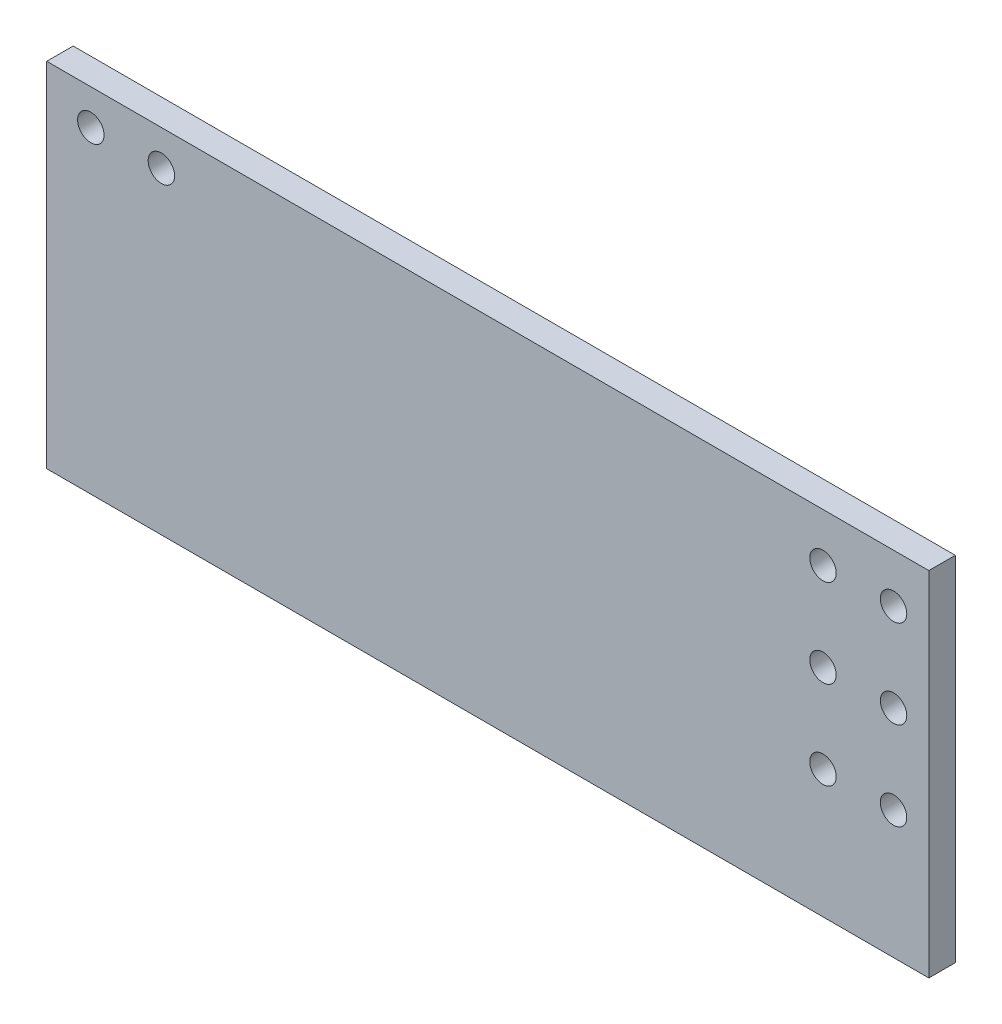
ISO-10303-21;
HEADER;
FILE_DESCRIPTION(('STEP AP214'),'2;1');
FILE_NAME('part.step','',(''),(''),'','','');
FILE_SCHEMA(('AUTOMOTIVE_DESIGN { 1 0 10303 214 1 1 1 1 }'));
ENDSEC;
DATA;
#1=APPLICATION_CONTEXT('core data for automotive mechanical design processes');
#2=APPLICATION_PROTOCOL_DEFINITION('international standard','automotive_design',2000,#1);
#3=PRODUCT_CONTEXT('',#1,'mechanical');
#4=PRODUCT('Part','Part','',(#3));
#5=PRODUCT_RELATED_PRODUCT_CATEGORY('part','',(#4));
#6=PRODUCT_DEFINITION_FORMATION('','',#4);
#7=PRODUCT_DEFINITION_CONTEXT('part definition',#1,'design');
#8=PRODUCT_DEFINITION('design','',#6,#7);
#9=PRODUCT_DEFINITION_SHAPE('','',#8);
#10=(LENGTH_UNIT() NAMED_UNIT(*) SI_UNIT(.MILLI.,.METRE.));
#11=(NAMED_UNIT(*) PLANE_ANGLE_UNIT() SI_UNIT($,.RADIAN.));
#12=(NAMED_UNIT(*) SI_UNIT($,.STERADIAN.) SOLID_ANGLE_UNIT());
#13=UNCERTAINTY_MEASURE_WITH_UNIT(LENGTH_MEASURE(1.E-05),#10,'distance_accuracy_value','');
#14=(GEOMETRIC_REPRESENTATION_CONTEXT(3) GLOBAL_UNCERTAINTY_ASSIGNED_CONTEXT((#13)) GLOBAL_UNIT_ASSIGNED_CONTEXT((#10,
#11,#12)) REPRESENTATION_CONTEXT('',''));
#15=CARTESIAN_POINT('',(0.,0.,0.));
#16=DIRECTION('',(0.,0.,1.));
#17=DIRECTION('',(1.,0.,0.));
#18=AXIS2_PLACEMENT_3D('',#15,#16,#17);
#19=CARTESIAN_POINT('',(0.,0.,3.));
#20=DIRECTION('',(0.,0.,-1.));
#21=DIRECTION('',(-1.,0.,0.));
#22=AXIS2_PLACEMENT_3D('',#19,#20,#21);
#23=PLANE('',#22);
#24=CARTESIAN_POINT('',(-45.,11.5,3.));
#25=DIRECTION('',(0.,0.,1.));
#26=DIRECTION('',(1.,0.,0.));
#27=AXIS2_PLACEMENT_3D('',#24,#25,#26);
#28=CIRCLE('',#27,1.5);
#29=CARTESIAN_POINT('',(-43.5,11.5,3.));
#30=VERTEX_POINT('',#29);
#31=EDGE_CURVE('E147',#30,#30,#28,.T.);
#32=ORIENTED_EDGE('',*,*,#31,.F.);
#33=EDGE_LOOP('',(#32));
#34=FACE_BOUND('',#33,.T.);
#35=CARTESIAN_POINT('',(-37.,11.5,3.));
#36=DIRECTION('',(0.,0.,1.));
#37=DIRECTION('',(1.,0.,0.));
#38=AXIS2_PLACEMENT_3D('',#35,#36,#37);
#39=CIRCLE('',#38,1.5);
#40=CARTESIAN_POINT('',(-35.5,11.5,3.));
#41=VERTEX_POINT('',#40);
#42=EDGE_CURVE('E141',#41,#41,#39,.T.);
#43=ORIENTED_EDGE('',*,*,#42,.F.);
#44=EDGE_LOOP('',(#43));
#45=FACE_BOUND('',#44,.T.);
#46=CARTESIAN_POINT('',(45.9999999999961,0.,3.));
#47=DIRECTION('',(0.,0.,1.));
#48=DIRECTION('',(1.,0.,0.));
#49=AXIS2_PLACEMENT_3D('',#46,#47,#48);
#50=CIRCLE('',#49,1.5);
#51=CARTESIAN_POINT('',(47.4999999999961,0.,3.));
#52=VERTEX_POINT('',#51);
#53=EDGE_CURVE('E116',#52,#52,#50,.T.);
#54=ORIENTED_EDGE('',*,*,#53,.F.);
#55=EDGE_LOOP('',(#54));
#56=FACE_BOUND('',#55,.T.);
#57=CARTESIAN_POINT('',(46.,-10.,3.));
#58=DIRECTION('',(0.,0.,1.));
#59=DIRECTION('',(-1.,0.,0.));
#60=AXIS2_PLACEMENT_3D('',#57,#58,#59);
#61=CIRCLE('',#60,1.5);
#62=CARTESIAN_POINT('',(44.5,-10.,3.));
#63=VERTEX_POINT('',#62);
#64=EDGE_CURVE('E104',#63,#63,#61,.T.);
#65=ORIENTED_EDGE('',*,*,#64,.F.);
#66=EDGE_LOOP('',(#65));
#67=FACE_BOUND('',#66,.T.);
#68=CARTESIAN_POINT('',(38.,10.,3.));
#69=DIRECTION('',(0.,0.,1.));
#70=DIRECTION('',(1.,0.,0.));
#71=AXIS2_PLACEMENT_3D('',#68,#69,#70);
#72=CIRCLE('',#71,1.5);
#73=CARTESIAN_POINT('',(39.5,10.,3.));
#74=VERTEX_POINT('',#73);
#75=EDGE_CURVE('E92',#74,#74,#72,.T.);
#76=ORIENTED_EDGE('',*,*,#75,.F.);
#77=EDGE_LOOP('',(#76));
#78=FACE_BOUND('',#77,.T.);
#79=DIRECTION('',(0.,-1.,0.));
#80=VECTOR('',#79,1.);
#81=CARTESIAN_POINT('',(-50.,-27.5,3.));
#82=LINE('',#81,#80);
#83=CARTESIAN_POINT('',(-50.,15.5,3.));
#84=VERTEX_POINT('',#83);
#85=CARTESIAN_POINT('',(-50.,-24.5,3.));
#86=VERTEX_POINT('',#85);
#87=EDGE_CURVE('E11',#84,#86,#82,.T.);
#88=ORIENTED_EDGE('',*,*,#87,.T.);
#89=DIRECTION('',(-1.,0.,0.));
#90=VECTOR('',#89,1.);
#91=CARTESIAN_POINT('',(50.,-24.5,3.));
#92=LINE('',#91,#90);
#93=CARTESIAN_POINT('',(50.,-24.5,3.));
#94=VERTEX_POINT('',#93);
#95=EDGE_CURVE('E50',#94,#86,#92,.T.);
#96=ORIENTED_EDGE('',*,*,#95,.F.);
#97=DIRECTION('',(0.,1.,0.));
#98=VECTOR('',#97,1.);
#99=CARTESIAN_POINT('',(50.,-27.5,3.));
#100=LINE('',#99,#98);
#101=CARTESIAN_POINT('',(50.,15.5,3.));
#102=VERTEX_POINT('',#101);
#103=EDGE_CURVE('E42',#94,#102,#100,.T.);
#104=ORIENTED_EDGE('',*,*,#103,.T.);
#105=DIRECTION('',(1.,0.,0.));
#106=VECTOR('',#105,1.);
#107=CARTESIAN_POINT('',(-50.,15.5,3.));
#108=LINE('',#107,#106);
#109=EDGE_CURVE('E134',#84,#102,#108,.T.);
#110=ORIENTED_EDGE('',*,*,#109,.F.);
#111=EDGE_LOOP('',(#88,#96,#104,#110));
#112=FACE_BOUND('',#111,.T.);
#113=CARTESIAN_POINT('',(46.,10.,3.));
#114=DIRECTION('',(0.,0.,1.));
#115=DIRECTION('',(1.,0.,0.));
#116=AXIS2_PLACEMENT_3D('',#113,#114,#115);
#117=CIRCLE('',#116,1.5);
#118=CARTESIAN_POINT('',(47.5,10.,3.));
#119=VERTEX_POINT('',#118);
#120=EDGE_CURVE('E99',#119,#119,#117,.T.);
#121=ORIENTED_EDGE('',*,*,#120,.F.);
#122=EDGE_LOOP('',(#121));
#123=FACE_BOUND('',#122,.T.);
#124=CARTESIAN_POINT('',(38.,-10.,3.));
#125=DIRECTION('',(0.,0.,1.));
#126=DIRECTION('',(-1.,0.,0.));
#127=AXIS2_PLACEMENT_3D('',#124,#125,#126);
#128=CIRCLE('',#127,1.5);
#129=CARTESIAN_POINT('',(36.5,-10.,3.));
#130=VERTEX_POINT('',#129);
#131=EDGE_CURVE('E110',#130,#130,#128,.T.);
#132=ORIENTED_EDGE('',*,*,#131,.F.);
#133=EDGE_LOOP('',(#132));
#134=FACE_BOUND('',#133,.T.);
#135=CARTESIAN_POINT('',(38.0000000000055,0.,3.));
#136=DIRECTION('',(0.,0.,1.));
#137=DIRECTION('',(1.,0.,0.));
#138=AXIS2_PLACEMENT_3D('',#135,#136,#137);
#139=CIRCLE('',#138,1.5);
#140=CARTESIAN_POINT('',(39.5000000000055,0.,3.));
#141=VERTEX_POINT('',#140);
#142=EDGE_CURVE('E122',#141,#141,#139,.T.);
#143=ORIENTED_EDGE('',*,*,#142,.F.);
#144=EDGE_LOOP('',(#143));
#145=FACE_BOUND('',#144,.T.);
#146=ADVANCED_FACE('F33',(#34,#45,#56,#67,#78,#112,#123,#134,#145),#23,.F.);
#147=CARTESIAN_POINT('',(0.,0.,0.));
#148=DIRECTION('',(0.,0.,-1.));
#149=DIRECTION('',(-1.,0.,0.));
#150=AXIS2_PLACEMENT_3D('',#147,#148,#149);
#151=PLANE('',#150);
#152=CARTESIAN_POINT('',(-45.,11.5,0.));
#153=DIRECTION('',(0.,0.,1.));
#154=DIRECTION('',(1.,0.,0.));
#155=AXIS2_PLACEMENT_3D('',#152,#153,#154);
#156=CIRCLE('',#155,1.5);
#157=CARTESIAN_POINT('',(-43.5,11.5,0.));
#158=VERTEX_POINT('',#157);
#159=EDGE_CURVE('E139',#158,#158,#156,.T.);
#160=ORIENTED_EDGE('',*,*,#159,.T.);
#161=EDGE_LOOP('',(#160));
#162=FACE_BOUND('',#161,.T.);
#163=CARTESIAN_POINT('',(-37.,11.5,0.));
#164=DIRECTION('',(0.,0.,1.));
#165=DIRECTION('',(1.,0.,0.));
#166=AXIS2_PLACEMENT_3D('',#163,#164,#165);
#167=CIRCLE('',#166,1.5);
#168=CARTESIAN_POINT('',(-35.5,11.5,0.));
#169=VERTEX_POINT('',#168);
#170=EDGE_CURVE('E144',#169,#169,#167,.T.);
#171=ORIENTED_EDGE('',*,*,#170,.T.);
#172=EDGE_LOOP('',(#171));
#173=FACE_BOUND('',#172,.T.);
#174=DIRECTION('',(-1.,0.,0.));
#175=VECTOR('',#174,1.);
#176=CARTESIAN_POINT('',(50.,-24.5,0.));
#177=LINE('',#176,#175);
#178=CARTESIAN_POINT('',(50.,-24.5,0.));
#179=VERTEX_POINT('',#178);
#180=CARTESIAN_POINT('',(-50.,-24.5,0.));
#181=VERTEX_POINT('',#180);
#182=EDGE_CURVE('E75',#179,#181,#177,.T.);
#183=ORIENTED_EDGE('',*,*,#182,.T.);
#184=DIRECTION('',(0.,-1.,0.));
#185=VECTOR('',#184,1.);
#186=CARTESIAN_POINT('',(-50.,-27.5,0.));
#187=LINE('',#186,#185);
#188=CARTESIAN_POINT('',(-50.,15.5,0.));
#189=VERTEX_POINT('',#188);
#190=EDGE_CURVE('E37',#189,#181,#187,.T.);
#191=ORIENTED_EDGE('',*,*,#190,.F.);
#192=DIRECTION('',(1.,0.,0.));
#193=VECTOR('',#192,1.);
#194=CARTESIAN_POINT('',(-50.,15.5,0.));
#195=LINE('',#194,#193);
#196=CARTESIAN_POINT('',(50.,15.5,0.));
#197=VERTEX_POINT('',#196);
#198=EDGE_CURVE('E58',#189,#197,#195,.T.);
#199=ORIENTED_EDGE('',*,*,#198,.T.);
#200=DIRECTION('',(0.,1.,0.));
#201=VECTOR('',#200,1.);
#202=CARTESIAN_POINT('',(50.,-27.5,0.));
#203=LINE('',#202,#201);
#204=EDGE_CURVE('E88',#179,#197,#203,.T.);
#205=ORIENTED_EDGE('',*,*,#204,.F.);
#206=EDGE_LOOP('',(#183,#191,#199,#205));
#207=FACE_BOUND('',#206,.T.);
#208=CARTESIAN_POINT('',(45.9999999999961,0.,0.));
#209=DIRECTION('',(0.,0.,1.));
#210=DIRECTION('',(1.,0.,0.));
#211=AXIS2_PLACEMENT_3D('',#208,#209,#210);
#212=CIRCLE('',#211,1.5);
#213=CARTESIAN_POINT('',(47.4999999999961,0.,0.));
#214=VERTEX_POINT('',#213);
#215=EDGE_CURVE('E119',#214,#214,#212,.T.);
#216=ORIENTED_EDGE('',*,*,#215,.T.);
#217=EDGE_LOOP('',(#216));
#218=FACE_BOUND('',#217,.T.);
#219=CARTESIAN_POINT('',(46.,-10.,0.));
#220=DIRECTION('',(0.,0.,1.));
#221=DIRECTION('',(-1.,0.,0.));
#222=AXIS2_PLACEMENT_3D('',#219,#220,#221);
#223=CIRCLE('',#222,1.5);
#224=CARTESIAN_POINT('',(44.5,-10.,0.));
#225=VERTEX_POINT('',#224);
#226=EDGE_CURVE('E107',#225,#225,#223,.T.);
#227=ORIENTED_EDGE('',*,*,#226,.T.);
#228=EDGE_LOOP('',(#227));
#229=FACE_BOUND('',#228,.T.);
#230=CARTESIAN_POINT('',(38.,10.,0.));
#231=DIRECTION('',(0.,0.,1.));
#232=DIRECTION('',(1.,0.,0.));
#233=AXIS2_PLACEMENT_3D('',#230,#231,#232);
#234=CIRCLE('',#233,1.5);
#235=CARTESIAN_POINT('',(39.5,10.,0.));
#236=VERTEX_POINT('',#235);
#237=EDGE_CURVE('E94',#236,#236,#234,.T.);
#238=ORIENTED_EDGE('',*,*,#237,.T.);
#239=EDGE_LOOP('',(#238));
#240=FACE_BOUND('',#239,.T.);
#241=CARTESIAN_POINT('',(46.,10.,0.));
#242=DIRECTION('',(0.,0.,1.));
#243=DIRECTION('',(1.,0.,0.));
#244=AXIS2_PLACEMENT_3D('',#241,#242,#243);
#245=CIRCLE('',#244,1.5);
#246=CARTESIAN_POINT('',(47.5,10.,0.));
#247=VERTEX_POINT('',#246);
#248=EDGE_CURVE('E101',#247,#247,#245,.T.);
#249=ORIENTED_EDGE('',*,*,#248,.T.);
#250=EDGE_LOOP('',(#249));
#251=FACE_BOUND('',#250,.T.);
#252=CARTESIAN_POINT('',(38.,-10.,0.));
#253=DIRECTION('',(0.,0.,1.));
#254=DIRECTION('',(-1.,0.,0.));
#255=AXIS2_PLACEMENT_3D('',#252,#253,#254);
#256=CIRCLE('',#255,1.5);
#257=CARTESIAN_POINT('',(36.5,-10.,0.));
#258=VERTEX_POINT('',#257);
#259=EDGE_CURVE('E113',#258,#258,#256,.T.);
#260=ORIENTED_EDGE('',*,*,#259,.T.);
#261=EDGE_LOOP('',(#260));
#262=FACE_BOUND('',#261,.T.);
#263=CARTESIAN_POINT('',(38.0000000000055,0.,0.));
#264=DIRECTION('',(0.,0.,1.));
#265=DIRECTION('',(1.,0.,0.));
#266=AXIS2_PLACEMENT_3D('',#263,#264,#265);
#267=CIRCLE('',#266,1.5);
#268=CARTESIAN_POINT('',(39.5000000000055,0.,0.));
#269=VERTEX_POINT('',#268);
#270=EDGE_CURVE('E125',#269,#269,#267,.T.);
#271=ORIENTED_EDGE('',*,*,#270,.T.);
#272=EDGE_LOOP('',(#271));
#273=FACE_BOUND('',#272,.T.);
#274=ADVANCED_FACE('F90',(#162,#173,#207,#218,#229,#240,#251,#262,#273),#151,.T.);
#275=CARTESIAN_POINT('',(50.,-27.5,3.));
#276=DIRECTION('',(-1.,0.,0.));
#277=DIRECTION('',(0.,0.,1.));
#278=AXIS2_PLACEMENT_3D('',#275,#276,#277);
#279=PLANE('',#278);
#280=ORIENTED_EDGE('',*,*,#103,.F.);
#281=DIRECTION('',(0.,0.,1.));
#282=VECTOR('',#281,1.);
#283=CARTESIAN_POINT('',(50.,-24.5,0.));
#284=LINE('',#283,#282);
#285=EDGE_CURVE('E78',#179,#94,#284,.T.);
#286=ORIENTED_EDGE('',*,*,#285,.F.);
#287=ORIENTED_EDGE('',*,*,#204,.T.);
#288=DIRECTION('',(0.,0.,1.));
#289=VECTOR('',#288,1.);
#290=CARTESIAN_POINT('',(50.,15.5,0.));
#291=LINE('',#290,#289);
#292=EDGE_CURVE('E128',#197,#102,#291,.T.);
#293=ORIENTED_EDGE('',*,*,#292,.T.);
#294=EDGE_LOOP('',(#280,#286,#287,#293));
#295=FACE_BOUND('',#294,.T.);
#296=ADVANCED_FACE('F35',(#295),#279,.F.);
#297=CARTESIAN_POINT('',(-50.,-27.5,3.));
#298=DIRECTION('',(1.,0.,0.));
#299=DIRECTION('',(0.,0.,-1.));
#300=AXIS2_PLACEMENT_3D('',#297,#298,#299);
#301=PLANE('',#300);
#302=ORIENTED_EDGE('',*,*,#190,.T.);
#303=DIRECTION('',(0.,0.,1.));
#304=VECTOR('',#303,1.);
#305=CARTESIAN_POINT('',(-50.,-24.5,0.));
#306=LINE('',#305,#304);
#307=EDGE_CURVE('E79',#181,#86,#306,.T.);
#308=ORIENTED_EDGE('',*,*,#307,.T.);
#309=ORIENTED_EDGE('',*,*,#87,.F.);
#310=DIRECTION('',(0.,0.,1.));
#311=VECTOR('',#310,1.);
#312=CARTESIAN_POINT('',(-50.,15.5,0.));
#313=LINE('',#312,#311);
#314=EDGE_CURVE('E131',#189,#84,#313,.T.);
#315=ORIENTED_EDGE('',*,*,#314,.F.);
#316=EDGE_LOOP('',(#302,#308,#309,#315));
#317=FACE_BOUND('',#316,.T.);
#318=ADVANCED_FACE('F196',(#317),#301,.F.);
#319=CARTESIAN_POINT('',(38.,10.,3.));
#320=DIRECTION('',(0.,0.,-1.));
#321=DIRECTION('',(-1.,0.,0.));
#322=AXIS2_PLACEMENT_3D('',#319,#320,#321);
#323=CYLINDRICAL_SURFACE('',#322,1.5);
#324=ORIENTED_EDGE('',*,*,#75,.T.);
#325=EDGE_LOOP('',(#324));
#326=FACE_BOUND('',#325,.T.);
#327=ORIENTED_EDGE('',*,*,#237,.F.);
#328=EDGE_LOOP('',(#327));
#329=FACE_BOUND('',#328,.T.);
#330=ADVANCED_FACE('F199',(#326,#329),#323,.F.);
#331=CARTESIAN_POINT('',(46.,10.,3.));
#332=DIRECTION('',(0.,0.,-1.));
#333=DIRECTION('',(-1.,0.,0.));
#334=AXIS2_PLACEMENT_3D('',#331,#332,#333);
#335=CYLINDRICAL_SURFACE('',#334,1.5);
#336=ORIENTED_EDGE('',*,*,#120,.T.);
#337=EDGE_LOOP('',(#336));
#338=FACE_BOUND('',#337,.T.);
#339=ORIENTED_EDGE('',*,*,#248,.F.);
#340=EDGE_LOOP('',(#339));
#341=FACE_BOUND('',#340,.T.);
#342=ADVANCED_FACE('F205',(#338,#341),#335,.F.);
#343=CARTESIAN_POINT('',(46.,-10.,3.));
#344=DIRECTION('',(0.,0.,-1.));
#345=DIRECTION('',(-1.,0.,0.));
#346=AXIS2_PLACEMENT_3D('',#343,#344,#345);
#347=CYLINDRICAL_SURFACE('',#346,1.5);
#348=ORIENTED_EDGE('',*,*,#64,.T.);
#349=EDGE_LOOP('',(#348));
#350=FACE_BOUND('',#349,.T.);
#351=ORIENTED_EDGE('',*,*,#226,.F.);
#352=EDGE_LOOP('',(#351));
#353=FACE_BOUND('',#352,.T.);
#354=ADVANCED_FACE('F221',(#350,#353),#347,.F.);
#355=CARTESIAN_POINT('',(38.,-10.,3.));
#356=DIRECTION('',(0.,0.,-1.));
#357=DIRECTION('',(-1.,0.,0.));
#358=AXIS2_PLACEMENT_3D('',#355,#356,#357);
#359=CYLINDRICAL_SURFACE('',#358,1.5);
#360=ORIENTED_EDGE('',*,*,#131,.T.);
#361=EDGE_LOOP('',(#360));
#362=FACE_BOUND('',#361,.T.);
#363=ORIENTED_EDGE('',*,*,#259,.F.);
#364=EDGE_LOOP('',(#363));
#365=FACE_BOUND('',#364,.T.);
#366=ADVANCED_FACE('F217',(#362,#365),#359,.F.);
#367=CARTESIAN_POINT('',(45.9999999999961,0.,3.));
#368=DIRECTION('',(0.,0.,-1.));
#369=DIRECTION('',(-1.,0.,0.));
#370=AXIS2_PLACEMENT_3D('',#367,#368,#369);
#371=CYLINDRICAL_SURFACE('',#370,1.5);
#372=ORIENTED_EDGE('',*,*,#53,.T.);
#373=EDGE_LOOP('',(#372));
#374=FACE_BOUND('',#373,.T.);
#375=ORIENTED_EDGE('',*,*,#215,.F.);
#376=EDGE_LOOP('',(#375));
#377=FACE_BOUND('',#376,.T.);
#378=ADVANCED_FACE('F186',(#374,#377),#371,.F.);
#379=CARTESIAN_POINT('',(38.0000000000055,0.,3.));
#380=DIRECTION('',(0.,0.,-1.));
#381=DIRECTION('',(-1.,0.,0.));
#382=AXIS2_PLACEMENT_3D('',#379,#380,#381);
#383=CYLINDRICAL_SURFACE('',#382,1.5);
#384=ORIENTED_EDGE('',*,*,#142,.T.);
#385=EDGE_LOOP('',(#384));
#386=FACE_BOUND('',#385,.T.);
#387=ORIENTED_EDGE('',*,*,#270,.F.);
#388=EDGE_LOOP('',(#387));
#389=FACE_BOUND('',#388,.T.);
#390=ADVANCED_FACE('F182',(#386,#389),#383,.F.);
#391=CARTESIAN_POINT('',(-50.,15.5,0.));
#392=DIRECTION('',(0.,-1.,0.));
#393=DIRECTION('',(1.,0.,0.));
#394=AXIS2_PLACEMENT_3D('',#391,#392,#393);
#395=PLANE('',#394);
#396=ORIENTED_EDGE('',*,*,#109,.T.);
#397=ORIENTED_EDGE('',*,*,#292,.F.);
#398=ORIENTED_EDGE('',*,*,#198,.F.);
#399=ORIENTED_EDGE('',*,*,#314,.T.);
#400=EDGE_LOOP('',(#396,#397,#398,#399));
#401=FACE_BOUND('',#400,.T.);
#402=ADVANCED_FACE('F185',(#401),#395,.F.);
#403=CARTESIAN_POINT('',(50.,-24.5,0.));
#404=DIRECTION('',(0.,1.,0.));
#405=DIRECTION('',(-1.,0.,0.));
#406=AXIS2_PLACEMENT_3D('',#403,#404,#405);
#407=PLANE('',#406);
#408=ORIENTED_EDGE('',*,*,#95,.T.);
#409=ORIENTED_EDGE('',*,*,#307,.F.);
#410=ORIENTED_EDGE('',*,*,#182,.F.);
#411=ORIENTED_EDGE('',*,*,#285,.T.);
#412=EDGE_LOOP('',(#408,#409,#410,#411));
#413=FACE_BOUND('',#412,.T.);
#414=ADVANCED_FACE('F77',(#413),#407,.F.);
#415=CARTESIAN_POINT('',(-37.,11.5,0.));
#416=DIRECTION('',(0.,0.,1.));
#417=DIRECTION('',(1.,0.,0.));
#418=AXIS2_PLACEMENT_3D('',#415,#416,#417);
#419=CYLINDRICAL_SURFACE('',#418,1.5);
#420=ORIENTED_EDGE('',*,*,#170,.F.);
#421=EDGE_LOOP('',(#420));
#422=FACE_BOUND('',#421,.T.);
#423=ORIENTED_EDGE('',*,*,#42,.T.);
#424=EDGE_LOOP('',(#423));
#425=FACE_BOUND('',#424,.T.);
#426=ADVANCED_FACE('F158',(#422,#425),#419,.F.);
#427=CARTESIAN_POINT('',(-45.,11.5,0.));
#428=DIRECTION('',(0.,0.,1.));
#429=DIRECTION('',(1.,0.,0.));
#430=AXIS2_PLACEMENT_3D('',#427,#428,#429);
#431=CYLINDRICAL_SURFACE('',#430,1.5);
#432=ORIENTED_EDGE('',*,*,#159,.F.);
#433=EDGE_LOOP('',(#432));
#434=FACE_BOUND('',#433,.T.);
#435=ORIENTED_EDGE('',*,*,#31,.T.);
#436=EDGE_LOOP('',(#435));
#437=FACE_BOUND('',#436,.T.);
#438=ADVANCED_FACE('F155',(#434,#437),#431,.F.);
#439=CLOSED_SHELL('',(#146,#274,#296,#318,#330,#342,#354,#366,#378,#390,#402,#414,#426,#438));
#440=MANIFOLD_SOLID_BREP('B2',#439);
#441=ADVANCED_BREP_SHAPE_REPRESENTATION('',(#18,#440),#14);
#442=SHAPE_DEFINITION_REPRESENTATION(#9,#441);
ENDSEC;
END-ISO-10303-21;
